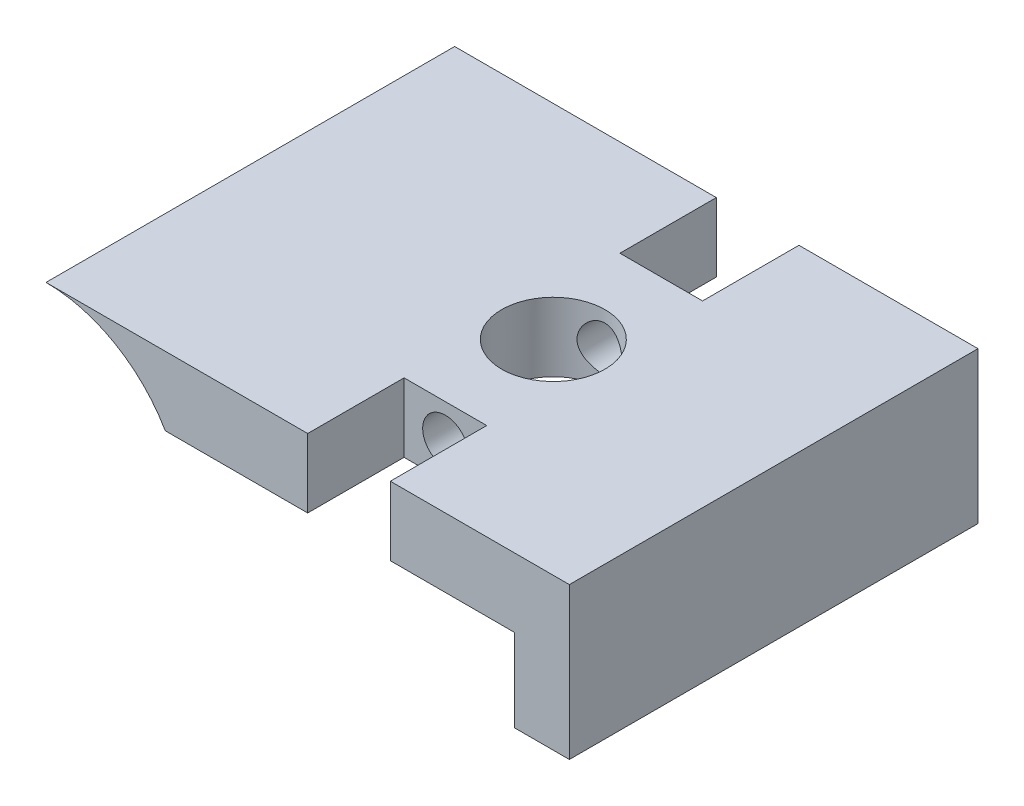
ISO-10303-21;
HEADER;
FILE_DESCRIPTION(('STEP AP214'),'2;1');
FILE_NAME('part.step','',(''),(''),'','','');
FILE_SCHEMA(('AUTOMOTIVE_DESIGN { 1 0 10303 214 1 1 1 1 }'));
ENDSEC;
DATA;
#1=APPLICATION_CONTEXT('core data for automotive mechanical design processes');
#2=APPLICATION_PROTOCOL_DEFINITION('international standard','automotive_design',2000,#1);
#3=PRODUCT_CONTEXT('',#1,'mechanical');
#4=PRODUCT('Part','Part','',(#3));
#5=PRODUCT_RELATED_PRODUCT_CATEGORY('part','',(#4));
#6=PRODUCT_DEFINITION_FORMATION('','',#4);
#7=PRODUCT_DEFINITION_CONTEXT('part definition',#1,'design');
#8=PRODUCT_DEFINITION('design','',#6,#7);
#9=PRODUCT_DEFINITION_SHAPE('','',#8);
#10=(LENGTH_UNIT() NAMED_UNIT(*) SI_UNIT(.MILLI.,.METRE.));
#11=(NAMED_UNIT(*) PLANE_ANGLE_UNIT() SI_UNIT($,.RADIAN.));
#12=(NAMED_UNIT(*) SI_UNIT($,.STERADIAN.) SOLID_ANGLE_UNIT());
#13=UNCERTAINTY_MEASURE_WITH_UNIT(LENGTH_MEASURE(1.E-05),#10,'distance_accuracy_value','');
#14=(GEOMETRIC_REPRESENTATION_CONTEXT(3) GLOBAL_UNCERTAINTY_ASSIGNED_CONTEXT((#13)) GLOBAL_UNIT_ASSIGNED_CONTEXT((#10,
#11,#12)) REPRESENTATION_CONTEXT('',''));
#15=CARTESIAN_POINT('',(0.,0.,0.));
#16=DIRECTION('',(0.,0.,1.));
#17=DIRECTION('',(1.,0.,0.));
#18=AXIS2_PLACEMENT_3D('',#15,#16,#17);
#19=CARTESIAN_POINT('',(3.,0.,-14.836));
#20=DIRECTION('',(0.,0.,1.));
#21=DIRECTION('',(1.,0.,0.));
#22=AXIS2_PLACEMENT_3D('',#19,#20,#21);
#23=CYLINDRICAL_SURFACE('',#22,1.65);
#24=CARTESIAN_POINT('',(4.65,0.,-3.36749164809655));
#25=CARTESIAN_POINT('',(4.64999591948725,-0.0874743691332474,-3.36749607292385));
#26=CARTESIAN_POINT('',(4.64299960015496,-0.175092773934513,-3.37094939684784));
#27=CARTESIAN_POINT('',(4.61531716545798,-0.34775711686567,-3.38429832583538));
#28=CARTESIAN_POINT('',(4.59459592274656,-0.432795867086391,-3.39421046041475));
#29=CARTESIAN_POINT('',(4.54044870220548,-0.597493099250677,-3.41912171212208));
#30=CARTESIAN_POINT('',(4.50707857419381,-0.677173445386291,-3.43409843617774));
#31=CARTESIAN_POINT('',(4.42874832845569,-0.829783884986517,-3.46741736925901));
#32=CARTESIAN_POINT('',(4.38379002894349,-0.902715034980066,-3.48575905018413));
#33=CARTESIAN_POINT('',(4.28021734567749,-1.04487154765316,-3.52516638479344));
#34=CARTESIAN_POINT('',(4.22091990046756,-1.11357209474115,-3.5463309106205));
#35=CARTESIAN_POINT('',(4.09178303274802,-1.240446840094,-3.5881911575404));
#36=CARTESIAN_POINT('',(4.02193928529622,-1.2986166981996,-3.60888668227713));
#37=CARTESIAN_POINT('',(3.86946484491626,-1.4055670834385,-3.64870271327509));
#38=CARTESIAN_POINT('',(3.78637319615618,-1.45374252984987,-3.66769507829857));
#39=CARTESIAN_POINT('',(3.61227632392994,-1.53520034882065,-3.700736202455));
#40=CARTESIAN_POINT('',(3.52127502438019,-1.56849005628031,-3.71478739560396));
#41=CARTESIAN_POINT('',(3.3394662745173,-1.61728382118505,-3.73565913311448));
#42=CARTESIAN_POINT('',(3.24894589824284,-1.63369687425849,-3.74284752867496));
#43=CARTESIAN_POINT('',(3.06617018053507,-1.65122350001049,-3.75052967187645));
#44=CARTESIAN_POINT('',(2.97391564874558,-1.65234404312535,-3.75102646959465));
#45=CARTESIAN_POINT('',(2.79695735459994,-1.63969762210197,-3.74547519866295));
#46=CARTESIAN_POINT('',(2.71216534970809,-1.62693375012661,-3.739868091581));
#47=CARTESIAN_POINT('',(2.5460705321449,-1.58862001141632,-3.72336083389609));
#48=CARTESIAN_POINT('',(2.46476797823857,-1.56306919822084,-3.71246029148675));
#49=CARTESIAN_POINT('',(2.30645273442336,-1.49962622377596,-3.68619520386884));
#50=CARTESIAN_POINT('',(2.22952453920683,-1.46155151512837,-3.67076501619212));
#51=CARTESIAN_POINT('',(2.08294686925941,-1.37433410623967,-3.63691910801703));
#52=CARTESIAN_POINT('',(2.01330005270581,-1.32518738450649,-3.6185023034251));
#53=CARTESIAN_POINT('',(1.87753504589473,-1.2128170119971,-3.57882020061428));
#54=CARTESIAN_POINT('',(1.81210572269681,-1.14879890575555,-3.5574447595915));
#55=CARTESIAN_POINT('',(1.69259260075723,-1.01070787762529,-3.51528240579217));
#56=CARTESIAN_POINT('',(1.63851423294623,-0.936630170451263,-3.49449577883282));
#57=CARTESIAN_POINT('',(1.54117220405855,-0.776800460066403,-3.45502479534648));
#58=CARTESIAN_POINT('',(1.49843008891747,-0.690699088400845,-3.43645839327868));
#59=CARTESIAN_POINT('',(1.42834028609234,-0.511490455495734,-3.40497856582965));
#60=CARTESIAN_POINT('',(1.40098013157646,-0.41838893735563,-3.39206056440346));
#61=CARTESIAN_POINT('',(1.36429227707905,-0.234744535363264,-3.37451456223478));
#62=CARTESIAN_POINT('',(1.35383875555708,-0.144476988157731,-3.36937064835985));
#63=CARTESIAN_POINT('',(1.34792333452705,0.0366498278836368,-3.3664757487194));
#64=CARTESIAN_POINT('',(1.35245516573099,0.127508833402344,-3.36872167133214));
#65=CARTESIAN_POINT('',(1.37535174013094,0.300038323378435,-3.37981562096985));
#66=CARTESIAN_POINT('',(1.39265374352297,0.381886932345066,-3.3881559621082));
#67=CARTESIAN_POINT('',(1.43914744636585,0.541431160999625,-3.40982287754369));
#68=CARTESIAN_POINT('',(1.46834214737761,0.619125726657321,-3.42315071054923));
#69=CARTESIAN_POINT('',(1.53921629690324,0.772027463841041,-3.45400682275722));
#70=CARTESIAN_POINT('',(1.58139272921155,0.846970827739317,-3.47169539316015));
#71=CARTESIAN_POINT('',(1.6765572613445,0.989101543315069,-3.50907546279441));
#72=CARTESIAN_POINT('',(1.72955038819797,1.05628526590526,-3.5287678911715));
#73=CARTESIAN_POINT('',(1.85062358980462,1.1874847750961,-3.57013856276202));
#74=CARTESIAN_POINT('',(1.9196470398001,1.25062896923802,-3.59183160476859));
#75=CARTESIAN_POINT('',(2.06778238636593,1.36462621623266,-3.63309467060809));
#76=CARTESIAN_POINT('',(2.14689558402023,1.41547768147164,-3.65266442003673));
#77=CARTESIAN_POINT('',(2.31400673932617,1.50362813045693,-3.68771558350776));
#78=CARTESIAN_POINT('',(2.40206664806587,1.54082304607771,-3.70316536765515));
#79=CARTESIAN_POINT('',(2.58405684732281,1.59956776607056,-3.72798894821772));
#80=CARTESIAN_POINT('',(2.6779831509097,1.62112807306507,-3.73736682301229));
#81=CARTESIAN_POINT('',(2.8612978165453,1.64656089333973,-3.74847245839303));
#82=CARTESIAN_POINT('',(2.95048512527525,1.65165818539735,-3.75072963755332));
#83=CARTESIAN_POINT('',(3.12843486064658,1.64739798838614,-3.74885512685435));
#84=CARTESIAN_POINT('',(3.21719737386056,1.63804358240264,-3.74472479968784));
#85=CARTESIAN_POINT('',(3.38782932587363,1.60602123171462,-3.7308324127445));
#86=CARTESIAN_POINT('',(3.46983114363675,1.58394115377816,-3.72131934376771));
#87=CARTESIAN_POINT('',(3.62890956243099,1.52777362465028,-3.69776205916142));
#88=CARTESIAN_POINT('',(3.70598528433432,1.49368403723099,-3.68371703743449));
#89=CARTESIAN_POINT('',(3.8569304617613,1.41274147649752,-3.65162935021383));
#90=CARTESIAN_POINT('',(3.93049119711801,1.3653752637279,-3.63343300227536));
#91=CARTESIAN_POINT('',(4.06894266820481,1.2599369507724,-3.59513976322225));
#92=CARTESIAN_POINT('',(4.13382977719906,1.20186039623366,-3.57504208305736));
#93=CARTESIAN_POINT('',(4.25831260974056,1.0713970399496,-3.53324031823005));
#94=CARTESIAN_POINT('',(4.31711532685678,0.998252385431571,-3.51153178279635));
#95=CARTESIAN_POINT('',(4.42177534917193,0.842529476107367,-3.47047923678989));
#96=CARTESIAN_POINT('',(4.46762474174624,0.759945498298501,-3.45113667556083));
#97=CARTESIAN_POINT('',(4.5449162136947,0.587124299309066,-3.41723991894322));
#98=CARTESIAN_POINT('',(4.57632700235197,0.496870953906528,-3.40269614232787));
#99=CARTESIAN_POINT('',(4.62309555077018,0.31164351772581,-3.38064338773551));
#100=CARTESIAN_POINT('',(4.6385071714776,0.216686400884627,-3.3731108155642));
#101=CARTESIAN_POINT('',(4.64703108329939,0.100998496777639,-3.36894448238601));
#102=CARTESIAN_POINT('',(4.64814335262455,0.0808209970433216,-3.36840080987488));
#103=CARTESIAN_POINT('',(4.64962829144477,0.0404315640214764,-3.3676738770119));
#104=CARTESIAN_POINT('',(4.65000094320723,0.02021962992,-3.36749062530128));
#105=CARTESIAN_POINT('',(4.65,0.,-3.36749164809655));
#106=B_SPLINE_CURVE_WITH_KNOTS('',3,(#24,#25,#26,#27,#28,#29,#30,#31,#32,#33,#34,#35,#36,#37,
#38,#39,#40,#41,#42,#43,#44,#45,#46,#47,#48,#49,#50,#51,#52,#53,#54,#55,#56,#57,#58,#59,#60,#61,
#62,#63,#64,#65,#66,#67,#68,#69,#70,#71,#72,#73,#74,#75,#76,#77,#78,#79,#80,#81,#82,#83,#84,#85,
#86,#87,#88,#89,#90,#91,#92,#93,#94,#95,#96,#97,#98,#99,#100,#101,#102,#103,#104,#105),
.UNSPECIFIED.,.T.,.F.,(4,2,2,2,2,2,2,2,2,2,2,2,2,2,2,2,2,2,2,2,2,2,2,2,2,2,2,2,2,2,2,2,2,2,2,2,
2,2,2,2,4),(0.,0.262337992001349,0.52535001551118,0.787214015160152,1.04903695265106,
1.32739302247777,1.60586355517072,1.89807751150631,2.19014732125288,2.46549872058573,
2.74072460857159,2.9973112845901,3.25391695538524,3.51444216606865,3.77506215572741,
4.05582705551463,4.33672598422601,4.62890596840992,4.92084880275994,5.1924046605751,
5.46384692437079,5.71493513596501,5.96608675823259,6.22839495294345,6.49082533337074,
6.77759301230099,7.06439770769602,7.35334470453729,7.64209741960136,7.90880391080322,
8.17545351143564,8.43067328899049,8.68593848747794,8.95289970595717,9.21997220307097,
9.50762420315226,9.79545153931286,10.0838997352209,10.371373694431,10.4320114560409,
10.4926506714452),.UNSPECIFIED.);
#107=CARTESIAN_POINT('',(4.65,0.,-3.36749164809655));
#108=VERTEX_POINT('',#107);
#109=EDGE_CURVE('E189',#108,#108,#106,.T.);
#110=ORIENTED_EDGE('',*,*,#109,.F.);
#111=EDGE_LOOP('',(#110));
#112=FACE_BOUND('',#111,.T.);
#113=CARTESIAN_POINT('',(3.,0.,-7.835));
#114=DIRECTION('',(0.,0.,1.));
#115=DIRECTION('',(1.,0.,0.));
#116=AXIS2_PLACEMENT_3D('',#113,#114,#115);
#117=CIRCLE('',#116,1.65);
#118=CARTESIAN_POINT('',(4.65,0.,-7.835));
#119=VERTEX_POINT('',#118);
#120=EDGE_CURVE('E522',#119,#119,#117,.T.);
#121=ORIENTED_EDGE('',*,*,#120,.F.);
#122=EDGE_LOOP('',(#121));
#123=FACE_BOUND('',#122,.T.);
#124=ADVANCED_FACE('F45',(#112,#123),#23,.F.);
#125=CARTESIAN_POINT('',(3.,-1.65,3.75));
#126=CARTESIAN_POINT('',(3.08794065243915,-1.64999603822561,3.74999677525689));
#127=CARTESIAN_POINT('',(3.17602118872722,-1.64292811014754,3.7468719189208));
#128=CARTESIAN_POINT('',(3.34965330491862,-1.61493414299233,3.734683166008));
#129=CARTESIAN_POINT('',(3.43519818666942,-1.59397431770864,3.72560479056562));
#130=CARTESIAN_POINT('',(3.60097235797527,-1.5391312845056,3.70247374212791));
#131=CARTESIAN_POINT('',(3.68121929706646,-1.505293822675,3.68843868963418));
#132=CARTESIAN_POINT('',(3.83481096834596,-1.42585820871192,3.65674015300381));
#133=CARTESIAN_POINT('',(3.90815735131846,-1.38026287916687,3.63907753990429));
#134=CARTESIAN_POINT('',(4.05000163649842,-1.27598104842036,3.60078615738986));
#135=CARTESIAN_POINT('',(4.11807366426439,-1.21675391782859,3.58005322837619));
#136=CARTESIAN_POINT('',(4.2436925761984,-1.08803679555134,3.53837779505836));
#137=CARTESIAN_POINT('',(4.30123331014303,-1.01854084946946,3.51743517577732));
#138=CARTESIAN_POINT('',(4.40737198125606,-0.866527492524002,3.47638120662905));
#139=CARTESIAN_POINT('',(4.45528386928224,-0.783497192018437,3.45638307676996));
#140=CARTESIAN_POINT('',(4.53627172599083,-0.609555260312117,3.4211597332649));
#141=CARTESIAN_POINT('',(4.56935619199839,-0.518648178890969,3.40593178742375));
#142=CARTESIAN_POINT('',(4.61794121689661,-0.336431274272992,3.3831135312385));
#143=CARTESIAN_POINT('',(4.63426566626132,-0.245387501455808,3.37516767353209));
#144=CARTESIAN_POINT('',(4.65143054751147,-0.0615333461945671,3.3668053594707));
#145=CARTESIAN_POINT('',(4.65228100759649,0.0312758530848424,3.36638402671406));
#146=CARTESIAN_POINT('',(4.63908919688508,0.207355873544219,3.3728210640382));
#147=CARTESIAN_POINT('',(4.6263414186449,0.290751689794494,3.37904671722602));
#148=CARTESIAN_POINT('',(4.58850520692875,0.454071225614267,3.39699646382114));
#149=CARTESIAN_POINT('',(4.56341407162607,0.533994180841886,3.40872176101459));
#150=CARTESIAN_POINT('',(4.50110649630305,0.690226926082278,3.43662073577462));
#151=CARTESIAN_POINT('',(4.46363227970243,0.766416489003947,3.45288773136686));
#152=CARTESIAN_POINT('',(4.37780710670809,0.911743878376031,3.48802159021638));
#153=CARTESIAN_POINT('',(4.32945161231713,0.980878745156235,3.50688953691531));
#154=CARTESIAN_POINT('',(4.21783776896922,1.1170679833526,3.54728261097474));
#155=CARTESIAN_POINT('',(4.15359849475329,1.18329659100235,3.56888963165699));
#156=CARTESIAN_POINT('',(4.01473808953318,1.30433611063186,3.61082599340459));
#157=CARTESIAN_POINT('',(3.94011395212262,1.35914370472459,3.63115496199219));
#158=CARTESIAN_POINT('',(3.7798454417349,1.45719190039968,3.66896451776513));
#159=CARTESIAN_POINT('',(3.69394811565676,1.50005943159355,3.68634771561839));
#160=CARTESIAN_POINT('',(3.51519989197508,1.57043908051859,3.71554130843415));
#161=CARTESIAN_POINT('',(3.42235333017466,1.59796068385571,3.72735514522372));
#162=CARTESIAN_POINT('',(3.23921022750968,1.63505304083377,3.74341295596741));
#163=CARTESIAN_POINT('',(3.14917854061997,1.64572966452197,3.74812228788192));
#164=CARTESIAN_POINT('',(2.96849247665595,1.65217171911425,3.75095455785044));
#165=CARTESIAN_POINT('',(2.87783831540075,1.64794208106068,3.74907967398628));
#166=CARTESIAN_POINT('',(2.70390665287527,1.62544881834208,3.73925037459651));
#167=CARTESIAN_POINT('',(2.62050230959726,1.60799437581934,3.73164663418775));
#168=CARTESIAN_POINT('',(2.45791706209694,1.56071027218963,3.71151728629914));
#169=CARTESIAN_POINT('',(2.37873667607145,1.53087909662229,3.69899107649862));
#170=CARTESIAN_POINT('',(2.22404079862632,1.45873229578337,3.66971134498956));
#171=CARTESIAN_POINT('',(2.14871703627142,1.41605581574277,3.65283800179973));
#172=CARTESIAN_POINT('',(2.00602810222664,1.31982329381418,3.61662102234894));
#173=CARTESIAN_POINT('',(1.93866640117435,1.26626253496257,3.5972763164179));
#174=CARTESIAN_POINT('',(1.80819611837274,1.14484038573232,3.55628214760163));
#175=CARTESIAN_POINT('',(1.74584598439285,1.07618271743489,3.53457144282308));
#176=CARTESIAN_POINT('',(1.63330445356359,0.929097206857131,3.49260064747062));
#177=CARTESIAN_POINT('',(1.58311709508679,0.850666132592151,3.47234104026915));
#178=CARTESIAN_POINT('',(1.49540307748589,0.683921591275962,3.43526035744154));
#179=CARTESIAN_POINT('',(1.45817723591055,0.595429542818637,3.4185241503665));
#180=CARTESIAN_POINT('',(1.39950438017547,0.412456963898668,3.39145640297362));
#181=CARTESIAN_POINT('',(1.37804232181517,0.31798223681692,3.38111875766089));
#182=CARTESIAN_POINT('',(1.35307874998712,0.134229339541118,3.36902436868046));
#183=CARTESIAN_POINT('',(1.34822601990919,0.0451768053067855,3.36662264808986));
#184=CARTESIAN_POINT('',(1.35292803694661,-0.132443324028021,3.36892598901368));
#185=CARTESIAN_POINT('',(1.36247987258739,-0.221011013494953,3.37362961438419));
#186=CARTESIAN_POINT('',(1.39454415171674,-0.389834130472385,3.38899632048545));
#187=CARTESIAN_POINT('',(1.41627535473376,-0.470274087988891,3.39929913530276));
#188=CARTESIAN_POINT('',(1.4712672768033,-0.626361280798593,3.42438089295876));
#189=CARTESIAN_POINT('',(1.50453131275969,-0.702007129869672,3.43916112337134));
#190=CARTESIAN_POINT('',(1.58406507679427,-0.851619735953305,3.47269356886383));
#191=CARTESIAN_POINT('',(1.63102681157857,-0.925174495154697,3.49163847278619));
#192=CARTESIAN_POINT('',(1.7357127896172,-1.06377992281056,3.53089238653571));
#193=CARTESIAN_POINT('',(1.79344141213049,-1.12882711256769,3.55120194925799));
#194=CARTESIAN_POINT('',(1.92382903951875,-1.25428003578287,3.59296880703805));
#195=CARTESIAN_POINT('',(1.99734015606778,-1.31382091586417,3.6143768693599));
#196=CARTESIAN_POINT('',(2.15406955877593,-1.41980560454866,3.65423468677977));
#197=CARTESIAN_POINT('',(2.23729223810855,-1.46624345307615,3.67268309400139));
#198=CARTESIAN_POINT('',(2.41023740744422,-1.54387701756614,3.70436408768263));
#199=CARTESIAN_POINT('',(2.49986734754799,-1.57525320509647,3.71765804406783));
#200=CARTESIAN_POINT('',(2.68371482188615,-1.62216171678277,3.73777368374933));
#201=CARTESIAN_POINT('',(2.77791736039553,-1.63774259010252,3.74461519501638));
#202=CARTESIAN_POINT('',(2.89387606102141,-1.64672172070879,3.7485588513459));
#203=CARTESIAN_POINT('',(2.91507632147087,-1.64794995964319,3.74909837906909));
#204=CARTESIAN_POINT('',(2.95751499929637,-1.64958958196251,3.74981934473969));
#205=CARTESIAN_POINT('',(2.97875341705226,-1.65000095717016,3.75000077910238));
#206=CARTESIAN_POINT('',(3.,-1.65,3.75));
#207=B_SPLINE_CURVE_WITH_KNOTS('',3,(#125,#126,#127,#128,#129,#130,#131,#132,#133,#134,#135,
#136,#137,#138,#139,#140,#141,#142,#143,#144,#145,#146,#147,#148,#149,#150,#151,#152,#153,#154,
#155,#156,#157,#158,#159,#160,#161,#162,#163,#164,#165,#166,#167,#168,#169,#170,#171,#172,#173,
#174,#175,#176,#177,#178,#179,#180,#181,#182,#183,#184,#185,#186,#187,#188,#189,#190,#191,#192,
#193,#194,#195,#196,#197,#198,#199,#200,#201,#202,#203,#204,#205,#206),.UNSPECIFIED.,.T.,.F.,(4,
2,2,2,2,2,2,2,2,2,2,2,2,2,2,2,2,2,2,2,2,2,2,2,2,2,2,2,2,2,2,2,2,2,2,2,2,2,2,2,4),(0.,
0.263734510147988,0.52811280905045,0.791560575603074,1.05494515780487,1.33150079465859,
1.60821742685178,1.90051649596435,2.19264783893791,2.46960925800041,2.74639118079142,
2.99899429642278,3.25165272874969,3.50994222706956,3.76833964437948,4.05135561937526,
4.33445369828947,4.62559874662744,4.91656363268483,5.18748705235547,5.45832085804592,
5.71380105020368,5.96931251303604,6.23280504553125,6.49641201330446,6.78088013255853,
7.06544257396593,7.35622693243307,7.64673341835486,7.91295937269032,8.17913152420861,
8.42991502344918,8.68077070926696,8.94756356427704,9.21446517058845,9.50405959505639,
9.79378553355286,10.0799474542432,10.3652271238324,10.4289451074685,10.4926637289549),.UNSPECIFIED.);
#208=CARTESIAN_POINT('',(3.,-1.65,3.75));
#209=VERTEX_POINT('',#208);
#210=EDGE_CURVE('E198',#209,#209,#207,.T.);
#211=ORIENTED_EDGE('',*,*,#210,.F.);
#212=EDGE_LOOP('',(#211));
#213=FACE_BOUND('',#212,.T.);
#214=CARTESIAN_POINT('',(3.,0.,7.835));
#215=DIRECTION('',(0.,0.,1.));
#216=DIRECTION('',(1.,0.,0.));
#217=AXIS2_PLACEMENT_3D('',#214,#215,#216);
#218=CIRCLE('',#217,1.65);
#219=CARTESIAN_POINT('',(4.65,0.,7.835));
#220=VERTEX_POINT('',#219);
#221=EDGE_CURVE('E482',#220,#220,#218,.T.);
#222=ORIENTED_EDGE('',*,*,#221,.T.);
#223=EDGE_LOOP('',(#222));
#224=FACE_BOUND('',#223,.T.);
#225=ADVANCED_FACE('F215',(#213,#224),#23,.F.);
#226=CARTESIAN_POINT('',(-19.,2.5,14.835));
#227=DIRECTION('',(0.,-1.,0.));
#228=DIRECTION('',(1.,0.,0.));
#229=AXIS2_PLACEMENT_3D('',#226,#227,#228);
#230=PLANE('',#229);
#231=CARTESIAN_POINT('',(3.,2.5,0.));
#232=DIRECTION('',(0.,1.,0.));
#233=DIRECTION('',(0.,0.,1.));
#234=AXIS2_PLACEMENT_3D('',#231,#232,#233);
#235=CIRCLE('',#234,3.75);
#236=CARTESIAN_POINT('',(3.,2.5,3.75));
#237=VERTEX_POINT('',#236);
#238=EDGE_CURVE('E181',#237,#237,#235,.T.);
#239=ORIENTED_EDGE('',*,*,#238,.F.);
#240=EDGE_LOOP('',(#239));
#241=FACE_BOUND('',#240,.T.);
#242=DIRECTION('',(0.,0.,-1.));
#243=VECTOR('',#242,1.);
#244=CARTESIAN_POINT('',(0.,2.5,-7.835));
#245=LINE('',#244,#243);
#246=CARTESIAN_POINT('',(0.,2.5,-7.835));
#247=VERTEX_POINT('',#246);
#248=CARTESIAN_POINT('',(0.,2.5,-14.835));
#249=VERTEX_POINT('',#248);
#250=EDGE_CURVE('E255',#247,#249,#245,.T.);
#251=ORIENTED_EDGE('',*,*,#250,.T.);
#252=DIRECTION('',(-1.,0.,0.));
#253=VECTOR('',#252,1.);
#254=CARTESIAN_POINT('',(-19.,2.5,-14.835));
#255=LINE('',#254,#253);
#256=CARTESIAN_POINT('',(-19.,2.5,-14.835));
#257=VERTEX_POINT('',#256);
#258=EDGE_CURVE('E258',#249,#257,#255,.T.);
#259=ORIENTED_EDGE('',*,*,#258,.T.);
#260=DIRECTION('',(0.,0.,-1.));
#261=VECTOR('',#260,1.);
#262=CARTESIAN_POINT('',(-19.,2.5,14.835));
#263=LINE('',#262,#261);
#264=CARTESIAN_POINT('',(-19.,2.5,14.835));
#265=VERTEX_POINT('',#264);
#266=EDGE_CURVE('E54',#265,#257,#263,.T.);
#267=ORIENTED_EDGE('',*,*,#266,.F.);
#268=DIRECTION('',(-1.,0.,0.));
#269=VECTOR('',#268,1.);
#270=CARTESIAN_POINT('',(-19.,2.5,14.835));
#271=LINE('',#270,#269);
#272=CARTESIAN_POINT('',(0.,2.5,14.835));
#273=VERTEX_POINT('',#272);
#274=EDGE_CURVE('E301',#273,#265,#271,.T.);
#275=ORIENTED_EDGE('',*,*,#274,.F.);
#276=DIRECTION('',(0.,0.,1.));
#277=VECTOR('',#276,1.);
#278=CARTESIAN_POINT('',(0.,2.5,7.835));
#279=LINE('',#278,#277);
#280=CARTESIAN_POINT('',(0.,2.5,7.835));
#281=VERTEX_POINT('',#280);
#282=EDGE_CURVE('E280',#281,#273,#279,.T.);
#283=ORIENTED_EDGE('',*,*,#282,.F.);
#284=DIRECTION('',(-1.,0.,0.));
#285=VECTOR('',#284,1.);
#286=CARTESIAN_POINT('',(6.,2.5,7.835));
#287=LINE('',#286,#285);
#288=CARTESIAN_POINT('',(6.,2.5,7.835));
#289=VERTEX_POINT('',#288);
#290=EDGE_CURVE('E487',#289,#281,#287,.T.);
#291=ORIENTED_EDGE('',*,*,#290,.F.);
#292=DIRECTION('',(0.,0.,1.));
#293=VECTOR('',#292,1.);
#294=CARTESIAN_POINT('',(6.,2.5,7.835));
#295=LINE('',#294,#293);
#296=CARTESIAN_POINT('',(6.,2.5,14.835));
#297=VERTEX_POINT('',#296);
#298=EDGE_CURVE('E490',#289,#297,#295,.T.);
#299=ORIENTED_EDGE('',*,*,#298,.T.);
#300=CARTESIAN_POINT('',(19.,2.5,14.835));
#301=VERTEX_POINT('',#300);
#302=EDGE_CURVE('E306',#301,#297,#271,.T.);
#303=ORIENTED_EDGE('',*,*,#302,.F.);
#304=DIRECTION('',(0.,0.,-1.));
#305=VECTOR('',#304,1.);
#306=CARTESIAN_POINT('',(19.,2.5,14.835));
#307=LINE('',#306,#305);
#308=CARTESIAN_POINT('',(19.,2.5,-14.835));
#309=VERTEX_POINT('',#308);
#310=EDGE_CURVE('E11',#301,#309,#307,.T.);
#311=ORIENTED_EDGE('',*,*,#310,.T.);
#312=CARTESIAN_POINT('',(5.99999999999999,2.5,-14.835));
#313=VERTEX_POINT('',#312);
#314=EDGE_CURVE('E275',#309,#313,#255,.T.);
#315=ORIENTED_EDGE('',*,*,#314,.T.);
#316=DIRECTION('',(0.,0.,-1.));
#317=VECTOR('',#316,1.);
#318=CARTESIAN_POINT('',(6.,2.5,-7.835));
#319=LINE('',#318,#317);
#320=CARTESIAN_POINT('',(6.,2.5,-7.835));
#321=VERTEX_POINT('',#320);
#322=EDGE_CURVE('E69',#321,#313,#319,.T.);
#323=ORIENTED_EDGE('',*,*,#322,.F.);
#324=DIRECTION('',(-1.,0.,0.));
#325=VECTOR('',#324,1.);
#326=CARTESIAN_POINT('',(6.,2.5,-7.835));
#327=LINE('',#326,#325);
#328=EDGE_CURVE('E261',#321,#247,#327,.T.);
#329=ORIENTED_EDGE('',*,*,#328,.T.);
#330=EDGE_LOOP('',(#251,#259,#267,#275,#283,#291,#299,#303,#311,#315,#323,#329));
#331=FACE_BOUND('',#330,.T.);
#332=ADVANCED_FACE('F222',(#241,#331),#230,.F.);
#333=CARTESIAN_POINT('',(-10.3397459621556,-2.5,14.835));
#334=DIRECTION('',(0.,1.,0.));
#335=DIRECTION('',(-1.,0.,0.));
#336=AXIS2_PLACEMENT_3D('',#333,#334,#335);
#337=PLANE('',#336);
#338=CARTESIAN_POINT('',(3.,-2.5,0.));
#339=DIRECTION('',(0.,1.,0.));
#340=DIRECTION('',(-1.,0.,0.));
#341=AXIS2_PLACEMENT_3D('',#338,#339,#340);
#342=CIRCLE('',#341,3.75);
#343=CARTESIAN_POINT('',(-0.750000000000004,-2.5,0.));
#344=VERTEX_POINT('',#343);
#345=EDGE_CURVE('E185',#344,#344,#342,.F.);
#346=ORIENTED_EDGE('',*,*,#345,.F.);
#347=EDGE_LOOP('',(#346));
#348=FACE_BOUND('',#347,.T.);
#349=DIRECTION('',(1.,0.,0.));
#350=VECTOR('',#349,1.);
#351=CARTESIAN_POINT('',(-10.3397459621556,-2.5,-14.835));
#352=LINE('',#351,#350);
#353=CARTESIAN_POINT('',(6.,-2.5,-14.835));
#354=VERTEX_POINT('',#353);
#355=CARTESIAN_POINT('',(15.,-2.5,-14.835));
#356=VERTEX_POINT('',#355);
#357=EDGE_CURVE('E286',#354,#356,#352,.T.);
#358=ORIENTED_EDGE('',*,*,#357,.T.);
#359=DIRECTION('',(0.,0.,1.));
#360=VECTOR('',#359,1.);
#361=CARTESIAN_POINT('',(15.,-2.5,-22.046102550928));
#362=LINE('',#361,#360);
#363=CARTESIAN_POINT('',(15.,-2.5,14.835));
#364=VERTEX_POINT('',#363);
#365=EDGE_CURVE('E169',#356,#364,#362,.T.);
#366=ORIENTED_EDGE('',*,*,#365,.T.);
#367=DIRECTION('',(1.,0.,0.));
#368=VECTOR('',#367,1.);
#369=CARTESIAN_POINT('',(-10.3397459621556,-2.5,14.835));
#370=LINE('',#369,#368);
#371=CARTESIAN_POINT('',(5.99999999999999,-2.5,14.835));
#372=VERTEX_POINT('',#371);
#373=EDGE_CURVE('E316',#372,#364,#370,.T.);
#374=ORIENTED_EDGE('',*,*,#373,.F.);
#375=DIRECTION('',(0.,0.,1.));
#376=VECTOR('',#375,1.);
#377=CARTESIAN_POINT('',(6.,-2.5,7.835));
#378=LINE('',#377,#376);
#379=CARTESIAN_POINT('',(6.,-2.5,7.835));
#380=VERTEX_POINT('',#379);
#381=EDGE_CURVE('E328',#380,#372,#378,.T.);
#382=ORIENTED_EDGE('',*,*,#381,.F.);
#383=DIRECTION('',(1.,0.,0.));
#384=VECTOR('',#383,1.);
#385=CARTESIAN_POINT('',(6.,-2.5,7.835));
#386=LINE('',#385,#384);
#387=CARTESIAN_POINT('',(0.,-2.5,7.835));
#388=VERTEX_POINT('',#387);
#389=EDGE_CURVE('E485',#388,#380,#386,.T.);
#390=ORIENTED_EDGE('',*,*,#389,.F.);
#391=DIRECTION('',(0.,0.,1.));
#392=VECTOR('',#391,1.);
#393=CARTESIAN_POINT('',(0.,-2.5,7.835));
#394=LINE('',#393,#392);
#395=CARTESIAN_POINT('',(0.,-2.5,14.835));
#396=VERTEX_POINT('',#395);
#397=EDGE_CURVE('E479',#388,#396,#394,.T.);
#398=ORIENTED_EDGE('',*,*,#397,.T.);
#399=CARTESIAN_POINT('',(-10.3397459621556,-2.5,14.835));
#400=VERTEX_POINT('',#399);
#401=EDGE_CURVE('E294',#400,#396,#370,.T.);
#402=ORIENTED_EDGE('',*,*,#401,.F.);
#403=DIRECTION('',(0.,0.,-1.));
#404=VECTOR('',#403,1.);
#405=CARTESIAN_POINT('',(-10.3397459621556,-2.5,14.835));
#406=LINE('',#405,#404);
#407=CARTESIAN_POINT('',(-10.3397459621556,-2.5,-14.835));
#408=VERTEX_POINT('',#407);
#409=EDGE_CURVE('E291',#400,#408,#406,.T.);
#410=ORIENTED_EDGE('',*,*,#409,.T.);
#411=CARTESIAN_POINT('',(0.,-2.5,-14.835));
#412=VERTEX_POINT('',#411);
#413=EDGE_CURVE('E287',#408,#412,#352,.T.);
#414=ORIENTED_EDGE('',*,*,#413,.T.);
#415=DIRECTION('',(0.,0.,-1.));
#416=VECTOR('',#415,1.);
#417=CARTESIAN_POINT('',(0.,-2.5,-7.835));
#418=LINE('',#417,#416);
#419=CARTESIAN_POINT('',(0.,-2.5,-7.835));
#420=VERTEX_POINT('',#419);
#421=EDGE_CURVE('E512',#420,#412,#418,.T.);
#422=ORIENTED_EDGE('',*,*,#421,.F.);
#423=DIRECTION('',(1.,0.,0.));
#424=VECTOR('',#423,1.);
#425=CARTESIAN_POINT('',(6.,-2.5,-7.835));
#426=LINE('',#425,#424);
#427=CARTESIAN_POINT('',(6.,-2.5,-7.835));
#428=VERTEX_POINT('',#427);
#429=EDGE_CURVE('E266',#420,#428,#426,.T.);
#430=ORIENTED_EDGE('',*,*,#429,.T.);
#431=DIRECTION('',(0.,0.,-1.));
#432=VECTOR('',#431,1.);
#433=CARTESIAN_POINT('',(6.,-2.5,-7.835));
#434=LINE('',#433,#432);
#435=EDGE_CURVE('E331',#428,#354,#434,.T.);
#436=ORIENTED_EDGE('',*,*,#435,.T.);
#437=EDGE_LOOP('',(#358,#366,#374,#382,#390,#398,#402,#410,#414,#422,#430,#436));
#438=FACE_BOUND('',#437,.T.);
#439=ADVANCED_FACE('F239',(#348,#438),#337,.F.);
#440=CARTESIAN_POINT('',(-19.,-7.5,-14.835));
#441=DIRECTION('',(0.,0.,-1.));
#442=DIRECTION('',(-1.,0.,0.));
#443=AXIS2_PLACEMENT_3D('',#440,#441,#442);
#444=PLANE('',#443);
#445=ORIENTED_EDGE('',*,*,#258,.F.);
#446=DIRECTION('',(0.,-1.,0.));
#447=VECTOR('',#446,1.);
#448=CARTESIAN_POINT('',(0.,-2.5,-14.835));
#449=LINE('',#448,#447);
#450=EDGE_CURVE('E271',#249,#412,#449,.T.);
#451=ORIENTED_EDGE('',*,*,#450,.T.);
#452=ORIENTED_EDGE('',*,*,#413,.F.);
#453=CARTESIAN_POINT('',(-19.,-7.5,-14.835));
#454=DIRECTION('',(0.,0.,-1.));
#455=DIRECTION('',(-1.,0.,0.));
#456=AXIS2_PLACEMENT_3D('',#453,#454,#455);
#457=CIRCLE('',#456,10.);
#458=EDGE_CURVE('E273',#257,#408,#457,.T.);
#459=ORIENTED_EDGE('',*,*,#458,.F.);
#460=EDGE_LOOP('',(#445,#451,#452,#459));
#461=FACE_BOUND('',#460,.T.);
#462=ADVANCED_FACE('F236',(#461),#444,.T.);
#463=ORIENTED_EDGE('',*,*,#357,.F.);
#464=DIRECTION('',(0.,1.,0.));
#465=VECTOR('',#464,1.);
#466=CARTESIAN_POINT('',(6.,-2.5,-14.835));
#467=LINE('',#466,#465);
#468=EDGE_CURVE('E333',#354,#313,#467,.T.);
#469=ORIENTED_EDGE('',*,*,#468,.T.);
#470=ORIENTED_EDGE('',*,*,#314,.F.);
#471=DIRECTION('',(0.,1.,0.));
#472=VECTOR('',#471,1.);
#473=CARTESIAN_POINT('',(19.,-2.5,-14.835));
#474=LINE('',#473,#472);
#475=CARTESIAN_POINT('',(19.,-8.5,-14.835));
#476=VERTEX_POINT('',#475);
#477=EDGE_CURVE('E154',#476,#309,#474,.T.);
#478=ORIENTED_EDGE('',*,*,#477,.F.);
#479=DIRECTION('',(1.,0.,0.));
#480=VECTOR('',#479,1.);
#481=CARTESIAN_POINT('',(19.,-8.5,-14.835));
#482=LINE('',#481,#480);
#483=CARTESIAN_POINT('',(15.,-8.5,-14.835));
#484=VERTEX_POINT('',#483);
#485=EDGE_CURVE('E147',#484,#476,#482,.T.);
#486=ORIENTED_EDGE('',*,*,#485,.F.);
#487=DIRECTION('',(0.,-1.,0.));
#488=VECTOR('',#487,1.);
#489=CARTESIAN_POINT('',(15.,-8.5,-14.835));
#490=LINE('',#489,#488);
#491=EDGE_CURVE('E152',#356,#484,#490,.T.);
#492=ORIENTED_EDGE('',*,*,#491,.F.);
#493=EDGE_LOOP('',(#463,#469,#470,#478,#486,#492));
#494=FACE_BOUND('',#493,.T.);
#495=ADVANCED_FACE('F150',(#494),#444,.T.);
#496=CARTESIAN_POINT('',(-19.,-7.5,14.835));
#497=DIRECTION('',(0.,0.,-1.));
#498=DIRECTION('',(-1.,0.,0.));
#499=AXIS2_PLACEMENT_3D('',#496,#497,#498);
#500=PLANE('',#499);
#501=ORIENTED_EDGE('',*,*,#401,.T.);
#502=DIRECTION('',(0.,-1.,0.));
#503=VECTOR('',#502,1.);
#504=CARTESIAN_POINT('',(0.,-2.5,14.835));
#505=LINE('',#504,#503);
#506=EDGE_CURVE('E477',#273,#396,#505,.T.);
#507=ORIENTED_EDGE('',*,*,#506,.F.);
#508=ORIENTED_EDGE('',*,*,#274,.T.);
#509=CARTESIAN_POINT('',(-19.,-7.5,14.835));
#510=DIRECTION('',(0.,0.,-1.));
#511=DIRECTION('',(-1.,0.,0.));
#512=AXIS2_PLACEMENT_3D('',#509,#510,#511);
#513=CIRCLE('',#512,10.);
#514=EDGE_CURVE('E298',#265,#400,#513,.T.);
#515=ORIENTED_EDGE('',*,*,#514,.T.);
#516=EDGE_LOOP('',(#501,#507,#508,#515));
#517=FACE_BOUND('',#516,.T.);
#518=ADVANCED_FACE('F235',(#517),#500,.F.);
#519=CARTESIAN_POINT('',(19.,-2.5,14.835));
#520=DIRECTION('',(-1.,0.,0.));
#521=DIRECTION('',(0.,0.,1.));
#522=AXIS2_PLACEMENT_3D('',#519,#520,#521);
#523=PLANE('',#522);
#524=ORIENTED_EDGE('',*,*,#477,.T.);
#525=ORIENTED_EDGE('',*,*,#310,.F.);
#526=DIRECTION('',(0.,1.,0.));
#527=VECTOR('',#526,1.);
#528=CARTESIAN_POINT('',(19.,-2.5,14.835));
#529=LINE('',#528,#527);
#530=CARTESIAN_POINT('',(19.,-8.5,14.835));
#531=VERTEX_POINT('',#530);
#532=EDGE_CURVE('E290',#531,#301,#529,.T.);
#533=ORIENTED_EDGE('',*,*,#532,.F.);
#534=DIRECTION('',(0.,0.,1.));
#535=VECTOR('',#534,1.);
#536=CARTESIAN_POINT('',(19.,-8.5,-22.046102550928));
#537=LINE('',#536,#535);
#538=EDGE_CURVE('E159',#476,#531,#537,.T.);
#539=ORIENTED_EDGE('',*,*,#538,.F.);
#540=EDGE_LOOP('',(#524,#525,#533,#539));
#541=FACE_BOUND('',#540,.T.);
#542=ADVANCED_FACE('F47',(#541),#523,.F.);
#543=CARTESIAN_POINT('',(-19.,-7.5,14.835));
#544=DIRECTION('',(0.,0.,-1.));
#545=DIRECTION('',(-1.,0.,0.));
#546=AXIS2_PLACEMENT_3D('',#543,#544,#545);
#547=CYLINDRICAL_SURFACE('',#546,10.);
#548=ORIENTED_EDGE('',*,*,#458,.T.);
#549=ORIENTED_EDGE('',*,*,#409,.F.);
#550=ORIENTED_EDGE('',*,*,#514,.F.);
#551=ORIENTED_EDGE('',*,*,#266,.T.);
#552=EDGE_LOOP('',(#548,#549,#550,#551));
#553=FACE_BOUND('',#552,.T.);
#554=ADVANCED_FACE('F233',(#553),#547,.F.);
#555=ORIENTED_EDGE('',*,*,#302,.T.);
#556=DIRECTION('',(0.,1.,0.));
#557=VECTOR('',#556,1.);
#558=CARTESIAN_POINT('',(6.,-2.5,14.835));
#559=LINE('',#558,#557);
#560=EDGE_CURVE('E324',#372,#297,#559,.T.);
#561=ORIENTED_EDGE('',*,*,#560,.F.);
#562=ORIENTED_EDGE('',*,*,#373,.T.);
#563=DIRECTION('',(0.,-1.,0.));
#564=VECTOR('',#563,1.);
#565=CARTESIAN_POINT('',(15.,-8.5,14.835));
#566=LINE('',#565,#564);
#567=CARTESIAN_POINT('',(15.,-8.5,14.835));
#568=VERTEX_POINT('',#567);
#569=EDGE_CURVE('E61',#364,#568,#566,.T.);
#570=ORIENTED_EDGE('',*,*,#569,.T.);
#571=DIRECTION('',(1.,0.,0.));
#572=VECTOR('',#571,1.);
#573=CARTESIAN_POINT('',(19.,-8.5,14.835));
#574=LINE('',#573,#572);
#575=EDGE_CURVE('E165',#568,#531,#574,.T.);
#576=ORIENTED_EDGE('',*,*,#575,.T.);
#577=ORIENTED_EDGE('',*,*,#532,.T.);
#578=EDGE_LOOP('',(#555,#561,#562,#570,#576,#577));
#579=FACE_BOUND('',#578,.T.);
#580=ADVANCED_FACE('F230',(#579),#500,.F.);
#581=CARTESIAN_POINT('',(0.,-2.5,7.835));
#582=DIRECTION('',(-1.,0.,0.));
#583=DIRECTION('',(0.,0.,1.));
#584=AXIS2_PLACEMENT_3D('',#581,#582,#583);
#585=PLANE('',#584);
#586=ORIENTED_EDGE('',*,*,#506,.T.);
#587=ORIENTED_EDGE('',*,*,#397,.F.);
#588=DIRECTION('',(0.,-1.,0.));
#589=VECTOR('',#588,1.);
#590=CARTESIAN_POINT('',(0.,-2.5,7.835));
#591=LINE('',#590,#589);
#592=EDGE_CURVE('E501',#281,#388,#591,.T.);
#593=ORIENTED_EDGE('',*,*,#592,.F.);
#594=ORIENTED_EDGE('',*,*,#282,.T.);
#595=EDGE_LOOP('',(#586,#587,#593,#594));
#596=FACE_BOUND('',#595,.T.);
#597=ADVANCED_FACE('F228',(#596),#585,.F.);
#598=CARTESIAN_POINT('',(6.,-2.5,7.835));
#599=DIRECTION('',(1.,0.,0.));
#600=DIRECTION('',(0.,0.,-1.));
#601=AXIS2_PLACEMENT_3D('',#598,#599,#600);
#602=PLANE('',#601);
#603=ORIENTED_EDGE('',*,*,#560,.T.);
#604=ORIENTED_EDGE('',*,*,#298,.F.);
#605=DIRECTION('',(0.,1.,0.));
#606=VECTOR('',#605,1.);
#607=CARTESIAN_POINT('',(6.,-2.5,7.835));
#608=LINE('',#607,#606);
#609=EDGE_CURVE('E493',#380,#289,#608,.T.);
#610=ORIENTED_EDGE('',*,*,#609,.F.);
#611=ORIENTED_EDGE('',*,*,#381,.T.);
#612=EDGE_LOOP('',(#603,#604,#610,#611));
#613=FACE_BOUND('',#612,.T.);
#614=ADVANCED_FACE('F423',(#613),#602,.F.);
#615=CARTESIAN_POINT('',(0.,0.,7.835));
#616=DIRECTION('',(0.,0.,1.));
#617=DIRECTION('',(1.,0.,0.));
#618=AXIS2_PLACEMENT_3D('',#615,#616,#617);
#619=PLANE('',#618);
#620=ORIENTED_EDGE('',*,*,#221,.F.);
#621=EDGE_LOOP('',(#620));
#622=FACE_BOUND('',#621,.T.);
#623=ORIENTED_EDGE('',*,*,#592,.T.);
#624=ORIENTED_EDGE('',*,*,#389,.T.);
#625=ORIENTED_EDGE('',*,*,#609,.T.);
#626=ORIENTED_EDGE('',*,*,#290,.T.);
#627=EDGE_LOOP('',(#623,#624,#625,#626));
#628=FACE_BOUND('',#627,.T.);
#629=ADVANCED_FACE('F394',(#622,#628),#619,.T.);
#630=CARTESIAN_POINT('',(0.,0.,-7.835));
#631=DIRECTION('',(0.,0.,-1.));
#632=DIRECTION('',(1.,0.,0.));
#633=AXIS2_PLACEMENT_3D('',#630,#631,#632);
#634=PLANE('',#633);
#635=DIRECTION('',(0.,-1.,0.));
#636=VECTOR('',#635,1.);
#637=CARTESIAN_POINT('',(0.,-2.5,-7.835));
#638=LINE('',#637,#636);
#639=EDGE_CURVE('E335',#247,#420,#638,.T.);
#640=ORIENTED_EDGE('',*,*,#639,.F.);
#641=ORIENTED_EDGE('',*,*,#328,.F.);
#642=DIRECTION('',(0.,1.,0.));
#643=VECTOR('',#642,1.);
#644=CARTESIAN_POINT('',(6.,-2.5,-7.835));
#645=LINE('',#644,#643);
#646=EDGE_CURVE('E525',#428,#321,#645,.T.);
#647=ORIENTED_EDGE('',*,*,#646,.F.);
#648=ORIENTED_EDGE('',*,*,#429,.F.);
#649=EDGE_LOOP('',(#640,#641,#647,#648));
#650=FACE_BOUND('',#649,.T.);
#651=ORIENTED_EDGE('',*,*,#120,.T.);
#652=EDGE_LOOP('',(#651));
#653=FACE_BOUND('',#652,.T.);
#654=ADVANCED_FACE('F385',(#650,#653),#634,.T.);
#655=CARTESIAN_POINT('',(0.,-2.5,-7.835));
#656=DIRECTION('',(1.,0.,0.));
#657=DIRECTION('',(0.,0.,-1.));
#658=AXIS2_PLACEMENT_3D('',#655,#656,#657);
#659=PLANE('',#658);
#660=ORIENTED_EDGE('',*,*,#450,.F.);
#661=ORIENTED_EDGE('',*,*,#250,.F.);
#662=ORIENTED_EDGE('',*,*,#639,.T.);
#663=ORIENTED_EDGE('',*,*,#421,.T.);
#664=EDGE_LOOP('',(#660,#661,#662,#663));
#665=FACE_BOUND('',#664,.T.);
#666=ADVANCED_FACE('F376',(#665),#659,.T.);
#667=CARTESIAN_POINT('',(6.,-2.5,-7.835));
#668=DIRECTION('',(-1.,0.,0.));
#669=DIRECTION('',(0.,0.,1.));
#670=AXIS2_PLACEMENT_3D('',#667,#668,#669);
#671=PLANE('',#670);
#672=ORIENTED_EDGE('',*,*,#468,.F.);
#673=ORIENTED_EDGE('',*,*,#435,.F.);
#674=ORIENTED_EDGE('',*,*,#646,.T.);
#675=ORIENTED_EDGE('',*,*,#322,.T.);
#676=EDGE_LOOP('',(#672,#673,#674,#675));
#677=FACE_BOUND('',#676,.T.);
#678=ADVANCED_FACE('F360',(#677),#671,.T.);
#679=CARTESIAN_POINT('',(3.,-2.501,0.));
#680=DIRECTION('',(0.,1.,0.));
#681=DIRECTION('',(0.,0.,1.));
#682=AXIS2_PLACEMENT_3D('',#679,#680,#681);
#683=CYLINDRICAL_SURFACE('',#682,3.75);
#684=ORIENTED_EDGE('',*,*,#238,.T.);
#685=EDGE_LOOP('',(#684));
#686=FACE_BOUND('',#685,.T.);
#687=ORIENTED_EDGE('',*,*,#345,.T.);
#688=EDGE_LOOP('',(#687));
#689=FACE_BOUND('',#688,.T.);
#690=ORIENTED_EDGE('',*,*,#109,.T.);
#691=EDGE_LOOP('',(#690));
#692=FACE_BOUND('',#691,.T.);
#693=ORIENTED_EDGE('',*,*,#210,.T.);
#694=EDGE_LOOP('',(#693));
#695=FACE_BOUND('',#694,.T.);
#696=ADVANCED_FACE('F203',(#686,#689,#692,#695),#683,.F.);
#697=CARTESIAN_POINT('',(15.,-8.5,-22.046102550928));
#698=DIRECTION('',(-1.,0.,0.));
#699=DIRECTION('',(0.,-1.,0.));
#700=AXIS2_PLACEMENT_3D('',#697,#698,#699);
#701=PLANE('',#700);
#702=ORIENTED_EDGE('',*,*,#365,.F.);
#703=ORIENTED_EDGE('',*,*,#491,.T.);
#704=DIRECTION('',(0.,0.,1.));
#705=VECTOR('',#704,1.);
#706=CARTESIAN_POINT('',(15.,-8.5,-22.046102550928));
#707=LINE('',#706,#705);
#708=EDGE_CURVE('E160',#484,#568,#707,.T.);
#709=ORIENTED_EDGE('',*,*,#708,.T.);
#710=ORIENTED_EDGE('',*,*,#569,.F.);
#711=EDGE_LOOP('',(#702,#703,#709,#710));
#712=FACE_BOUND('',#711,.T.);
#713=ADVANCED_FACE('F168',(#712),#701,.T.);
#714=CARTESIAN_POINT('',(19.,-8.5,-22.046102550928));
#715=DIRECTION('',(0.,-1.,0.));
#716=DIRECTION('',(1.,0.,0.));
#717=AXIS2_PLACEMENT_3D('',#714,#715,#716);
#718=PLANE('',#717);
#719=ORIENTED_EDGE('',*,*,#708,.F.);
#720=ORIENTED_EDGE('',*,*,#485,.T.);
#721=ORIENTED_EDGE('',*,*,#538,.T.);
#722=ORIENTED_EDGE('',*,*,#575,.F.);
#723=EDGE_LOOP('',(#719,#720,#721,#722));
#724=FACE_BOUND('',#723,.T.);
#725=ADVANCED_FACE('F163',(#724),#718,.T.);
#726=CLOSED_SHELL('',(#124,#225,#332,#439,#462,#495,#518,#542,#554,#580,#597,#614,#629,#654,
#666,#678,#696,#713,#725));
#727=MANIFOLD_SOLID_BREP('B2',#726);
#728=ADVANCED_BREP_SHAPE_REPRESENTATION('',(#18,#727),#14);
#729=SHAPE_DEFINITION_REPRESENTATION(#9,#728);
ENDSEC;
END-ISO-10303-21;
